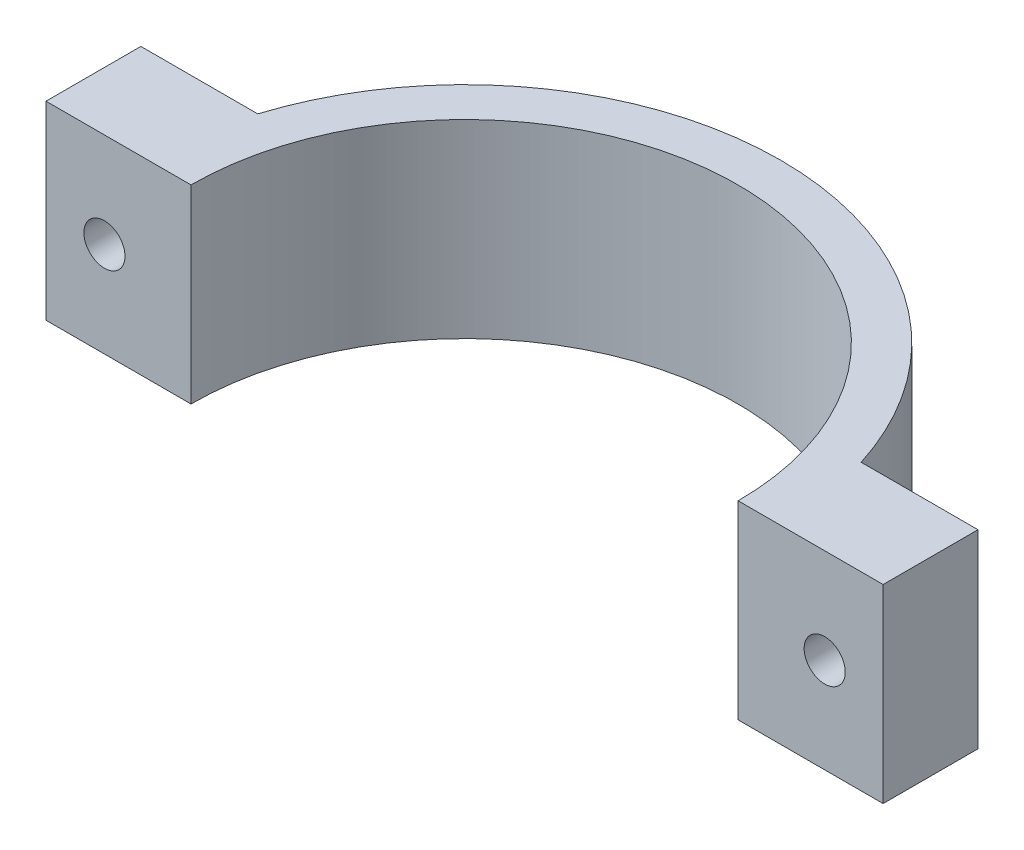
ISO-10303-21;
HEADER;
FILE_DESCRIPTION(('STEP AP214'),'2;1');
FILE_NAME('part.step','',(''),(''),'','','');
FILE_SCHEMA(('AUTOMOTIVE_DESIGN { 1 0 10303 214 1 1 1 1 }'));
ENDSEC;
DATA;
#1=APPLICATION_CONTEXT('core data for automotive mechanical design processes');
#2=APPLICATION_PROTOCOL_DEFINITION('international standard','automotive_design',2000,#1);
#3=PRODUCT_CONTEXT('',#1,'mechanical');
#4=PRODUCT('Part','Part','',(#3));
#5=PRODUCT_RELATED_PRODUCT_CATEGORY('part','',(#4));
#6=PRODUCT_DEFINITION_FORMATION('','',#4);
#7=PRODUCT_DEFINITION_CONTEXT('part definition',#1,'design');
#8=PRODUCT_DEFINITION('design','',#6,#7);
#9=PRODUCT_DEFINITION_SHAPE('','',#8);
#10=(LENGTH_UNIT() NAMED_UNIT(*) SI_UNIT(.MILLI.,.METRE.));
#11=(NAMED_UNIT(*) PLANE_ANGLE_UNIT() SI_UNIT($,.RADIAN.));
#12=(NAMED_UNIT(*) SI_UNIT($,.STERADIAN.) SOLID_ANGLE_UNIT());
#13=UNCERTAINTY_MEASURE_WITH_UNIT(LENGTH_MEASURE(1.E-05),#10,'distance_accuracy_value','');
#14=(GEOMETRIC_REPRESENTATION_CONTEXT(3) GLOBAL_UNCERTAINTY_ASSIGNED_CONTEXT((#13)) GLOBAL_UNIT_ASSIGNED_CONTEXT((#10,
#11,#12)) REPRESENTATION_CONTEXT('',''));
#15=CARTESIAN_POINT('',(0.,0.,0.));
#16=DIRECTION('',(0.,0.,1.));
#17=DIRECTION('',(1.,0.,0.));
#18=AXIS2_PLACEMENT_3D('',#15,#16,#17);
#19=CARTESIAN_POINT('',(0.,15.,0.));
#20=DIRECTION('',(0.,-1.,0.));
#21=DIRECTION('',(0.,0.,-1.));
#22=AXIS2_PLACEMENT_3D('',#19,#20,#21);
#23=CYLINDRICAL_SURFACE('',#22,43.25);
#24=CARTESIAN_POINT('',(0.,-15.,0.));
#25=DIRECTION('',(0.,-1.,0.));
#26=DIRECTION('',(0.,0.,-1.));
#27=AXIS2_PLACEMENT_3D('',#24,#25,#26);
#28=CIRCLE('',#27,43.25);
#29=CARTESIAN_POINT('',(-43.25,-15.,0.));
#30=VERTEX_POINT('',#29);
#31=CARTESIAN_POINT('',(43.25,-15.,0.));
#32=VERTEX_POINT('',#31);
#33=EDGE_CURVE('E135',#30,#32,#28,.T.);
#34=ORIENTED_EDGE('',*,*,#33,.T.);
#35=DIRECTION('',(0.,-1.,0.));
#36=VECTOR('',#35,1.);
#37=CARTESIAN_POINT('',(43.25,15.,0.));
#38=LINE('',#37,#36);
#39=CARTESIAN_POINT('',(43.25,15.,0.));
#40=VERTEX_POINT('',#39);
#41=EDGE_CURVE('E11',#40,#32,#38,.T.);
#42=ORIENTED_EDGE('',*,*,#41,.F.);
#43=CARTESIAN_POINT('',(0.,15.,0.));
#44=DIRECTION('',(0.,-1.,0.));
#45=DIRECTION('',(0.,0.,-1.));
#46=AXIS2_PLACEMENT_3D('',#43,#44,#45);
#47=CIRCLE('',#46,43.25);
#48=CARTESIAN_POINT('',(-43.25,15.,0.));
#49=VERTEX_POINT('',#48);
#50=EDGE_CURVE('E150',#49,#40,#47,.T.);
#51=ORIENTED_EDGE('',*,*,#50,.F.);
#52=DIRECTION('',(0.,-1.,0.));
#53=VECTOR('',#52,1.);
#54=CARTESIAN_POINT('',(-43.25,15.,0.));
#55=LINE('',#54,#53);
#56=EDGE_CURVE('E131',#49,#30,#55,.T.);
#57=ORIENTED_EDGE('',*,*,#56,.T.);
#58=EDGE_LOOP('',(#34,#42,#51,#57));
#59=FACE_BOUND('',#58,.T.);
#60=ADVANCED_FACE('F39',(#59),#23,.F.);
#61=CARTESIAN_POINT('',(43.25,15.,0.));
#62=DIRECTION('',(0.,0.,-1.));
#63=DIRECTION('',(-1.,0.,0.));
#64=AXIS2_PLACEMENT_3D('',#61,#62,#63);
#65=PLANE('',#64);
#66=CARTESIAN_POINT('',(56.9359800354236,0.,0.));
#67=DIRECTION('',(0.,0.,-1.));
#68=DIRECTION('',(1.,0.,0.));
#69=AXIS2_PLACEMENT_3D('',#66,#67,#68);
#70=CIRCLE('',#69,3.25);
#71=CARTESIAN_POINT('',(53.6859800354236,0.,0.));
#72=VERTEX_POINT('',#71);
#73=EDGE_CURVE('E183',#72,#72,#70,.T.);
#74=ORIENTED_EDGE('',*,*,#73,.T.);
#75=EDGE_LOOP('',(#74));
#76=FACE_BOUND('',#75,.T.);
#77=DIRECTION('',(1.,0.,0.));
#78=VECTOR('',#77,1.);
#79=CARTESIAN_POINT('',(43.25,-15.,0.));
#80=LINE('',#79,#78);
#81=CARTESIAN_POINT('',(66.175,-15.,0.));
#82=VERTEX_POINT('',#81);
#83=EDGE_CURVE('E138',#32,#82,#80,.T.);
#84=ORIENTED_EDGE('',*,*,#83,.T.);
#85=DIRECTION('',(0.,-1.,0.));
#86=VECTOR('',#85,1.);
#87=CARTESIAN_POINT('',(66.175,15.,0.));
#88=LINE('',#87,#86);
#89=CARTESIAN_POINT('',(66.175,15.,0.));
#90=VERTEX_POINT('',#89);
#91=EDGE_CURVE('E47',#90,#82,#88,.T.);
#92=ORIENTED_EDGE('',*,*,#91,.F.);
#93=DIRECTION('',(1.,0.,0.));
#94=VECTOR('',#93,1.);
#95=CARTESIAN_POINT('',(43.25,15.,0.));
#96=LINE('',#95,#94);
#97=EDGE_CURVE('E98',#40,#90,#96,.T.);
#98=ORIENTED_EDGE('',*,*,#97,.F.);
#99=ORIENTED_EDGE('',*,*,#41,.T.);
#100=EDGE_LOOP('',(#84,#92,#98,#99));
#101=FACE_BOUND('',#100,.T.);
#102=ADVANCED_FACE('F215',(#76,#101),#65,.F.);
#103=CARTESIAN_POINT('',(66.175,15.,0.));
#104=DIRECTION('',(-1.,0.,0.));
#105=DIRECTION('',(0.,0.,1.));
#106=AXIS2_PLACEMENT_3D('',#103,#104,#105);
#107=PLANE('',#106);
#108=DIRECTION('',(0.,0.,-1.));
#109=VECTOR('',#108,1.);
#110=CARTESIAN_POINT('',(66.175,-15.,0.));
#111=LINE('',#110,#109);
#112=CARTESIAN_POINT('',(66.175,-15.,-15.));
#113=VERTEX_POINT('',#112);
#114=EDGE_CURVE('E141',#82,#113,#111,.T.);
#115=ORIENTED_EDGE('',*,*,#114,.T.);
#116=DIRECTION('',(0.,-1.,0.));
#117=VECTOR('',#116,1.);
#118=CARTESIAN_POINT('',(66.175,15.,-15.));
#119=LINE('',#118,#117);
#120=CARTESIAN_POINT('',(66.175,15.,-15.));
#121=VERTEX_POINT('',#120);
#122=EDGE_CURVE('E157',#121,#113,#119,.T.);
#123=ORIENTED_EDGE('',*,*,#122,.F.);
#124=DIRECTION('',(0.,0.,-1.));
#125=VECTOR('',#124,1.);
#126=CARTESIAN_POINT('',(66.175,15.,0.));
#127=LINE('',#126,#125);
#128=EDGE_CURVE('E165',#90,#121,#127,.T.);
#129=ORIENTED_EDGE('',*,*,#128,.F.);
#130=ORIENTED_EDGE('',*,*,#91,.T.);
#131=EDGE_LOOP('',(#115,#123,#129,#130));
#132=FACE_BOUND('',#131,.T.);
#133=ADVANCED_FACE('F163',(#132),#107,.F.);
#134=CARTESIAN_POINT('',(47.6969600708473,15.,-15.));
#135=DIRECTION('',(0.,0.,1.));
#136=DIRECTION('',(1.,0.,0.));
#137=AXIS2_PLACEMENT_3D('',#134,#135,#136);
#138=PLANE('',#137);
#139=CARTESIAN_POINT('',(56.9359800354236,0.,-15.));
#140=DIRECTION('',(0.,0.,-1.));
#141=DIRECTION('',(1.,0.,0.));
#142=AXIS2_PLACEMENT_3D('',#139,#140,#141);
#143=CIRCLE('',#142,3.25);
#144=CARTESIAN_POINT('',(53.6859800354236,0.,-15.));
#145=VERTEX_POINT('',#144);
#146=EDGE_CURVE('E186',#145,#145,#143,.T.);
#147=ORIENTED_EDGE('',*,*,#146,.F.);
#148=EDGE_LOOP('',(#147));
#149=FACE_BOUND('',#148,.T.);
#150=DIRECTION('',(-1.,0.,0.));
#151=VECTOR('',#150,1.);
#152=CARTESIAN_POINT('',(47.6969600708473,-15.,-15.));
#153=LINE('',#152,#151);
#154=CARTESIAN_POINT('',(47.6969600708473,-15.,-15.));
#155=VERTEX_POINT('',#154);
#156=EDGE_CURVE('E143',#113,#155,#153,.T.);
#157=ORIENTED_EDGE('',*,*,#156,.T.);
#158=DIRECTION('',(0.,-1.,0.));
#159=VECTOR('',#158,1.);
#160=CARTESIAN_POINT('',(47.6969600708473,15.,-15.));
#161=LINE('',#160,#159);
#162=CARTESIAN_POINT('',(47.6969600708473,15.,-15.));
#163=VERTEX_POINT('',#162);
#164=EDGE_CURVE('E154',#163,#155,#161,.T.);
#165=ORIENTED_EDGE('',*,*,#164,.F.);
#166=DIRECTION('',(-1.,0.,0.));
#167=VECTOR('',#166,1.);
#168=CARTESIAN_POINT('',(47.6969600708473,15.,-15.));
#169=LINE('',#168,#167);
#170=EDGE_CURVE('E177',#121,#163,#169,.T.);
#171=ORIENTED_EDGE('',*,*,#170,.F.);
#172=ORIENTED_EDGE('',*,*,#122,.T.);
#173=EDGE_LOOP('',(#157,#165,#171,#172));
#174=FACE_BOUND('',#173,.T.);
#175=ADVANCED_FACE('F173',(#149,#174),#138,.F.);
#176=CARTESIAN_POINT('',(0.,15.,0.));
#177=DIRECTION('',(0.,-1.,0.));
#178=DIRECTION('',(0.,0.,-1.));
#179=AXIS2_PLACEMENT_3D('',#176,#177,#178);
#180=CYLINDRICAL_SURFACE('',#179,50.);
#181=CARTESIAN_POINT('',(0.,-15.,0.));
#182=DIRECTION('',(0.,1.,0.));
#183=DIRECTION('',(0.,0.,-1.));
#184=AXIS2_PLACEMENT_3D('',#181,#182,#183);
#185=CIRCLE('',#184,50.);
#186=CARTESIAN_POINT('',(-47.6969600708473,-15.,-15.));
#187=VERTEX_POINT('',#186);
#188=EDGE_CURVE('E145',#155,#187,#185,.T.);
#189=ORIENTED_EDGE('',*,*,#188,.T.);
#190=DIRECTION('',(0.,-1.,0.));
#191=VECTOR('',#190,1.);
#192=CARTESIAN_POINT('',(-47.6969600708473,15.,-15.));
#193=LINE('',#192,#191);
#194=CARTESIAN_POINT('',(-47.6969600708473,15.,-15.));
#195=VERTEX_POINT('',#194);
#196=EDGE_CURVE('E126',#195,#187,#193,.T.);
#197=ORIENTED_EDGE('',*,*,#196,.F.);
#198=CARTESIAN_POINT('',(0.,15.,0.));
#199=DIRECTION('',(0.,1.,0.));
#200=DIRECTION('',(0.,0.,-1.));
#201=AXIS2_PLACEMENT_3D('',#198,#199,#200);
#202=CIRCLE('',#201,50.);
#203=EDGE_CURVE('E117',#163,#195,#202,.T.);
#204=ORIENTED_EDGE('',*,*,#203,.F.);
#205=ORIENTED_EDGE('',*,*,#164,.T.);
#206=EDGE_LOOP('',(#189,#197,#204,#205));
#207=FACE_BOUND('',#206,.T.);
#208=ADVANCED_FACE('F176',(#207),#180,.T.);
#209=CARTESIAN_POINT('',(-66.175,15.,-15.));
#210=DIRECTION('',(0.,0.,1.));
#211=DIRECTION('',(1.,0.,0.));
#212=AXIS2_PLACEMENT_3D('',#209,#210,#211);
#213=PLANE('',#212);
#214=CARTESIAN_POINT('',(-56.9359800354236,0.,-15.));
#215=DIRECTION('',(0.,0.,-1.));
#216=DIRECTION('',(-1.,0.,0.));
#217=AXIS2_PLACEMENT_3D('',#214,#215,#216);
#218=CIRCLE('',#217,3.25);
#219=CARTESIAN_POINT('',(-60.1859800354236,0.,-15.));
#220=VERTEX_POINT('',#219);
#221=EDGE_CURVE('E189',#220,#220,#218,.T.);
#222=ORIENTED_EDGE('',*,*,#221,.F.);
#223=EDGE_LOOP('',(#222));
#224=FACE_BOUND('',#223,.T.);
#225=DIRECTION('',(-1.,0.,0.));
#226=VECTOR('',#225,1.);
#227=CARTESIAN_POINT('',(-66.175,-15.,-15.));
#228=LINE('',#227,#226);
#229=CARTESIAN_POINT('',(-66.175,-15.,-15.));
#230=VERTEX_POINT('',#229);
#231=EDGE_CURVE('E125',#187,#230,#228,.T.);
#232=ORIENTED_EDGE('',*,*,#231,.T.);
#233=DIRECTION('',(0.,-1.,0.));
#234=VECTOR('',#233,1.);
#235=CARTESIAN_POINT('',(-66.175,15.,-15.));
#236=LINE('',#235,#234);
#237=CARTESIAN_POINT('',(-66.175,15.,-15.));
#238=VERTEX_POINT('',#237);
#239=EDGE_CURVE('E122',#238,#230,#236,.T.);
#240=ORIENTED_EDGE('',*,*,#239,.F.);
#241=DIRECTION('',(-1.,0.,0.));
#242=VECTOR('',#241,1.);
#243=CARTESIAN_POINT('',(-66.175,15.,-15.));
#244=LINE('',#243,#242);
#245=EDGE_CURVE('E111',#195,#238,#244,.T.);
#246=ORIENTED_EDGE('',*,*,#245,.F.);
#247=ORIENTED_EDGE('',*,*,#196,.T.);
#248=EDGE_LOOP('',(#232,#240,#246,#247));
#249=FACE_BOUND('',#248,.T.);
#250=ADVANCED_FACE('F123',(#224,#249),#213,.F.);
#251=CARTESIAN_POINT('',(-66.175,15.,0.));
#252=DIRECTION('',(1.,0.,0.));
#253=DIRECTION('',(0.,0.,-1.));
#254=AXIS2_PLACEMENT_3D('',#251,#252,#253);
#255=PLANE('',#254);
#256=DIRECTION('',(0.,0.,1.));
#257=VECTOR('',#256,1.);
#258=CARTESIAN_POINT('',(-66.175,-15.,0.));
#259=LINE('',#258,#257);
#260=CARTESIAN_POINT('',(-66.175,-15.,0.));
#261=VERTEX_POINT('',#260);
#262=EDGE_CURVE('E84',#230,#261,#259,.T.);
#263=ORIENTED_EDGE('',*,*,#262,.T.);
#264=DIRECTION('',(0.,-1.,0.));
#265=VECTOR('',#264,1.);
#266=CARTESIAN_POINT('',(-66.175,15.,0.));
#267=LINE('',#266,#265);
#268=CARTESIAN_POINT('',(-66.175,15.,0.));
#269=VERTEX_POINT('',#268);
#270=EDGE_CURVE('E127',#269,#261,#267,.T.);
#271=ORIENTED_EDGE('',*,*,#270,.F.);
#272=DIRECTION('',(0.,0.,1.));
#273=VECTOR('',#272,1.);
#274=CARTESIAN_POINT('',(-66.175,15.,0.));
#275=LINE('',#274,#273);
#276=EDGE_CURVE('E115',#238,#269,#275,.T.);
#277=ORIENTED_EDGE('',*,*,#276,.F.);
#278=ORIENTED_EDGE('',*,*,#239,.T.);
#279=EDGE_LOOP('',(#263,#271,#277,#278));
#280=FACE_BOUND('',#279,.T.);
#281=ADVANCED_FACE('F129',(#280),#255,.F.);
#282=CARTESIAN_POINT('',(-66.175,15.,0.));
#283=DIRECTION('',(0.,0.,-1.));
#284=DIRECTION('',(-1.,0.,0.));
#285=AXIS2_PLACEMENT_3D('',#282,#283,#284);
#286=PLANE('',#285);
#287=CARTESIAN_POINT('',(-56.9359800354236,0.,0.));
#288=DIRECTION('',(0.,0.,-1.));
#289=DIRECTION('',(-1.,0.,0.));
#290=AXIS2_PLACEMENT_3D('',#287,#288,#289);
#291=CIRCLE('',#290,3.25);
#292=CARTESIAN_POINT('',(-60.1859800354236,0.,0.));
#293=VERTEX_POINT('',#292);
#294=EDGE_CURVE('E139',#293,#293,#291,.T.);
#295=ORIENTED_EDGE('',*,*,#294,.T.);
#296=EDGE_LOOP('',(#295));
#297=FACE_BOUND('',#296,.T.);
#298=DIRECTION('',(1.,0.,0.));
#299=VECTOR('',#298,1.);
#300=CARTESIAN_POINT('',(-66.175,-15.,0.));
#301=LINE('',#300,#299);
#302=EDGE_CURVE('E90',#261,#30,#301,.T.);
#303=ORIENTED_EDGE('',*,*,#302,.T.);
#304=ORIENTED_EDGE('',*,*,#56,.F.);
#305=DIRECTION('',(1.,0.,0.));
#306=VECTOR('',#305,1.);
#307=CARTESIAN_POINT('',(-66.175,15.,0.));
#308=LINE('',#307,#306);
#309=EDGE_CURVE('E55',#269,#49,#308,.T.);
#310=ORIENTED_EDGE('',*,*,#309,.F.);
#311=ORIENTED_EDGE('',*,*,#270,.T.);
#312=EDGE_LOOP('',(#303,#304,#310,#311));
#313=FACE_BOUND('',#312,.T.);
#314=ADVANCED_FACE('F195',(#297,#313),#286,.F.);
#315=CARTESIAN_POINT('',(0.,15.,0.));
#316=DIRECTION('',(0.,-1.,0.));
#317=DIRECTION('',(0.,0.,-1.));
#318=AXIS2_PLACEMENT_3D('',#315,#316,#317);
#319=PLANE('',#318);
#320=ORIENTED_EDGE('',*,*,#50,.T.);
#321=ORIENTED_EDGE('',*,*,#97,.T.);
#322=ORIENTED_EDGE('',*,*,#128,.T.);
#323=ORIENTED_EDGE('',*,*,#170,.T.);
#324=ORIENTED_EDGE('',*,*,#203,.T.);
#325=ORIENTED_EDGE('',*,*,#245,.T.);
#326=ORIENTED_EDGE('',*,*,#276,.T.);
#327=ORIENTED_EDGE('',*,*,#309,.T.);
#328=EDGE_LOOP('',(#320,#321,#322,#323,#324,#325,#326,#327));
#329=FACE_BOUND('',#328,.T.);
#330=ADVANCED_FACE('F113',(#329),#319,.F.);
#331=CARTESIAN_POINT('',(0.,-15.,0.));
#332=DIRECTION('',(0.,-1.,0.));
#333=DIRECTION('',(0.,0.,-1.));
#334=AXIS2_PLACEMENT_3D('',#331,#332,#333);
#335=PLANE('',#334);
#336=ORIENTED_EDGE('',*,*,#33,.F.);
#337=ORIENTED_EDGE('',*,*,#302,.F.);
#338=ORIENTED_EDGE('',*,*,#262,.F.);
#339=ORIENTED_EDGE('',*,*,#231,.F.);
#340=ORIENTED_EDGE('',*,*,#188,.F.);
#341=ORIENTED_EDGE('',*,*,#156,.F.);
#342=ORIENTED_EDGE('',*,*,#114,.F.);
#343=ORIENTED_EDGE('',*,*,#83,.F.);
#344=EDGE_LOOP('',(#336,#337,#338,#339,#340,#341,#342,#343));
#345=FACE_BOUND('',#344,.T.);
#346=ADVANCED_FACE('F169',(#345),#335,.T.);
#347=CARTESIAN_POINT('',(-56.9359800354236,0.,0.));
#348=DIRECTION('',(0.,0.,-1.));
#349=DIRECTION('',(-1.,0.,0.));
#350=AXIS2_PLACEMENT_3D('',#347,#348,#349);
#351=CYLINDRICAL_SURFACE('',#350,3.25);
#352=CARTESIAN_POINT('',(-60.1859800354236,0.,0.));
#353=CARTESIAN_POINT('',(-60.1859800354236,0.,-0.15625));
#354=CARTESIAN_POINT('',(-60.1859800354236,0.,-0.3125));
#355=CARTESIAN_POINT('',(-60.1859800354236,0.,-0.625));
#356=CARTESIAN_POINT('',(-60.1859800354236,0.,-0.78125));
#357=CARTESIAN_POINT('',(-60.1859800354236,0.,-1.09375));
#358=CARTESIAN_POINT('',(-60.1859800354236,0.,-1.25));
#359=CARTESIAN_POINT('',(-60.1859800354236,0.,-1.5625));
#360=CARTESIAN_POINT('',(-60.1859800354236,0.,-1.71875));
#361=CARTESIAN_POINT('',(-60.1859800354236,0.,-2.03125));
#362=CARTESIAN_POINT('',(-60.1859800354236,0.,-2.1875));
#363=CARTESIAN_POINT('',(-60.1859800354236,0.,-2.5));
#364=CARTESIAN_POINT('',(-60.1859800354236,0.,-2.65625));
#365=CARTESIAN_POINT('',(-60.1859800354236,0.,-2.96875));
#366=CARTESIAN_POINT('',(-60.1859800354236,0.,-3.125));
#367=CARTESIAN_POINT('',(-60.1859800354236,0.,-3.4375));
#368=CARTESIAN_POINT('',(-60.1859800354236,0.,-3.59375));
#369=CARTESIAN_POINT('',(-60.1859800354236,0.,-3.90625));
#370=CARTESIAN_POINT('',(-60.1859800354236,0.,-4.0625));
#371=CARTESIAN_POINT('',(-60.1859800354236,0.,-4.375));
#372=CARTESIAN_POINT('',(-60.1859800354236,0.,-4.53125));
#373=CARTESIAN_POINT('',(-60.1859800354236,0.,-4.84375));
#374=CARTESIAN_POINT('',(-60.1859800354236,0.,-5.));
#375=CARTESIAN_POINT('',(-60.1859800354236,0.,-5.3125));
#376=CARTESIAN_POINT('',(-60.1859800354236,0.,-5.46875));
#377=CARTESIAN_POINT('',(-60.1859800354236,0.,-5.78125));
#378=CARTESIAN_POINT('',(-60.1859800354236,0.,-5.9375));
#379=CARTESIAN_POINT('',(-60.1859800354236,0.,-6.25));
#380=CARTESIAN_POINT('',(-60.1859800354236,0.,-6.40625));
#381=CARTESIAN_POINT('',(-60.1859800354236,0.,-6.71875));
#382=CARTESIAN_POINT('',(-60.1859800354236,0.,-6.875));
#383=CARTESIAN_POINT('',(-60.1859800354236,0.,-7.1875));
#384=CARTESIAN_POINT('',(-60.1859800354236,0.,-7.34375));
#385=CARTESIAN_POINT('',(-60.1859800354236,0.,-7.65625));
#386=CARTESIAN_POINT('',(-60.1859800354236,0.,-7.8125));
#387=CARTESIAN_POINT('',(-60.1859800354236,0.,-8.125));
#388=CARTESIAN_POINT('',(-60.1859800354236,0.,-8.28125));
#389=CARTESIAN_POINT('',(-60.1859800354236,0.,-8.59375));
#390=CARTESIAN_POINT('',(-60.1859800354236,0.,-8.75));
#391=CARTESIAN_POINT('',(-60.1859800354236,0.,-9.0625));
#392=CARTESIAN_POINT('',(-60.1859800354236,0.,-9.21875));
#393=CARTESIAN_POINT('',(-60.1859800354236,0.,-9.53125));
#394=CARTESIAN_POINT('',(-60.1859800354236,0.,-9.6875));
#395=CARTESIAN_POINT('',(-60.1859800354236,0.,-10.));
#396=CARTESIAN_POINT('',(-60.1859800354236,0.,-10.15625));
#397=CARTESIAN_POINT('',(-60.1859800354236,0.,-10.46875));
#398=CARTESIAN_POINT('',(-60.1859800354236,0.,-10.625));
#399=CARTESIAN_POINT('',(-60.1859800354236,0.,-10.9375));
#400=CARTESIAN_POINT('',(-60.1859800354236,0.,-11.09375));
#401=CARTESIAN_POINT('',(-60.1859800354236,0.,-11.40625));
#402=CARTESIAN_POINT('',(-60.1859800354236,0.,-11.5625));
#403=CARTESIAN_POINT('',(-60.1859800354236,0.,-11.875));
#404=CARTESIAN_POINT('',(-60.1859800354236,0.,-12.03125));
#405=CARTESIAN_POINT('',(-60.1859800354236,0.,-12.34375));
#406=CARTESIAN_POINT('',(-60.1859800354236,0.,-12.5));
#407=CARTESIAN_POINT('',(-60.1859800354236,0.,-12.8125));
#408=CARTESIAN_POINT('',(-60.1859800354236,0.,-12.96875));
#409=CARTESIAN_POINT('',(-60.1859800354236,0.,-13.28125));
#410=CARTESIAN_POINT('',(-60.1859800354236,0.,-13.4375));
#411=CARTESIAN_POINT('',(-60.1859800354236,0.,-13.75));
#412=CARTESIAN_POINT('',(-60.1859800354236,0.,-13.90625));
#413=CARTESIAN_POINT('',(-60.1859800354236,0.,-14.21875));
#414=CARTESIAN_POINT('',(-60.1859800354236,0.,-14.375));
#415=CARTESIAN_POINT('',(-60.1859800354236,0.,-14.6875));
#416=CARTESIAN_POINT('',(-60.1859800354236,0.,-14.84375));
#417=CARTESIAN_POINT('',(-60.1859800354236,0.,-15.));
#418=B_SPLINE_CURVE_WITH_KNOTS('',3,(#352,#353,#354,#355,#356,#357,#358,#359,#360,#361,#362,
#363,#364,#365,#366,#367,#368,#369,#370,#371,#372,#373,#374,#375,#376,#377,#378,#379,#380,#381,
#382,#383,#384,#385,#386,#387,#388,#389,#390,#391,#392,#393,#394,#395,#396,#397,#398,#399,#400,
#401,#402,#403,#404,#405,#406,#407,#408,#409,#410,#411,#412,#413,#414,#415,#416,#417),
.UNSPECIFIED.,.F.,.F.,(4,2,2,2,2,2,2,2,2,2,2,2,2,2,2,2,2,2,2,2,2,2,2,2,2,2,2,2,2,2,2,2,4),(0.,
0.46875,0.9375,1.40625,1.875,2.34375,2.8125,3.28125,3.75,4.21875,4.6875,5.15625,5.625,6.09375,
6.5625,7.03125,7.5,7.96875,8.4375,8.90625,9.375,9.84375,10.3125,10.78125,11.25,11.71875,12.1875,
12.65625,13.125,13.59375,14.0625,14.53125,15.),.UNSPECIFIED.);
#419=EDGE_CURVE('BSEAM197',#293,#220,#418,.T.);
#420=ORIENTED_EDGE('',*,*,#294,.F.);
#421=ORIENTED_EDGE('',*,*,#221,.T.);
#422=ORIENTED_EDGE('',*,*,#419,.T.);
#423=ORIENTED_EDGE('',*,*,#419,.F.);
#424=EDGE_LOOP('',(#420,#422,#421,#423));
#425=FACE_BOUND('',#424,.T.);
#426=ADVANCED_FACE('F197',(#425),#351,.F.);
#427=CARTESIAN_POINT('',(56.9359800354236,0.,0.));
#428=DIRECTION('',(0.,0.,-1.));
#429=DIRECTION('',(-1.,0.,0.));
#430=AXIS2_PLACEMENT_3D('',#427,#428,#429);
#431=CYLINDRICAL_SURFACE('',#430,3.25);
#432=CARTESIAN_POINT('',(53.6859800354236,0.,0.));
#433=CARTESIAN_POINT('',(53.6859800354236,0.,-0.15624999999999));
#434=CARTESIAN_POINT('',(53.6859800354236,0.,-0.31249999999999));
#435=CARTESIAN_POINT('',(53.6859800354236,0.,-0.62499999999999));
#436=CARTESIAN_POINT('',(53.6859800354236,0.,-0.78124999999999));
#437=CARTESIAN_POINT('',(53.6859800354236,0.,-1.09374999999999));
#438=CARTESIAN_POINT('',(53.6859800354236,0.,-1.24999999999999));
#439=CARTESIAN_POINT('',(53.6859800354236,0.,-1.56249999999999));
#440=CARTESIAN_POINT('',(53.6859800354236,0.,-1.71874999999999));
#441=CARTESIAN_POINT('',(53.6859800354236,0.,-2.03124999999999));
#442=CARTESIAN_POINT('',(53.6859800354236,0.,-2.18749999999999));
#443=CARTESIAN_POINT('',(53.6859800354236,0.,-2.49999999999999));
#444=CARTESIAN_POINT('',(53.6859800354236,0.,-2.65624999999999));
#445=CARTESIAN_POINT('',(53.6859800354236,0.,-2.96874999999999));
#446=CARTESIAN_POINT('',(53.6859800354236,0.,-3.12499999999999));
#447=CARTESIAN_POINT('',(53.6859800354236,0.,-3.43749999999999));
#448=CARTESIAN_POINT('',(53.6859800354236,0.,-3.59374999999999));
#449=CARTESIAN_POINT('',(53.6859800354236,0.,-3.90624999999999));
#450=CARTESIAN_POINT('',(53.6859800354236,0.,-4.06249999999999));
#451=CARTESIAN_POINT('',(53.6859800354236,0.,-4.37499999999999));
#452=CARTESIAN_POINT('',(53.6859800354236,0.,-4.53124999999999));
#453=CARTESIAN_POINT('',(53.6859800354236,0.,-4.84374999999999));
#454=CARTESIAN_POINT('',(53.6859800354236,0.,-4.99999999999999));
#455=CARTESIAN_POINT('',(53.6859800354236,0.,-5.31249999999999));
#456=CARTESIAN_POINT('',(53.6859800354236,0.,-5.46874999999999));
#457=CARTESIAN_POINT('',(53.6859800354236,0.,-5.78124999999999));
#458=CARTESIAN_POINT('',(53.6859800354236,0.,-5.93749999999999));
#459=CARTESIAN_POINT('',(53.6859800354236,0.,-6.24999999999999));
#460=CARTESIAN_POINT('',(53.6859800354236,0.,-6.40624999999999));
#461=CARTESIAN_POINT('',(53.6859800354236,0.,-6.71874999999999));
#462=CARTESIAN_POINT('',(53.6859800354236,0.,-6.87499999999999));
#463=CARTESIAN_POINT('',(53.6859800354236,0.,-7.18749999999999));
#464=CARTESIAN_POINT('',(53.6859800354236,0.,-7.34374999999999));
#465=CARTESIAN_POINT('',(53.6859800354236,0.,-7.65624999999999));
#466=CARTESIAN_POINT('',(53.6859800354236,0.,-7.81249999999999));
#467=CARTESIAN_POINT('',(53.6859800354236,0.,-8.12499999999999));
#468=CARTESIAN_POINT('',(53.6859800354236,0.,-8.28124999999999));
#469=CARTESIAN_POINT('',(53.6859800354236,0.,-8.59374999999999));
#470=CARTESIAN_POINT('',(53.6859800354236,0.,-8.74999999999999));
#471=CARTESIAN_POINT('',(53.6859800354236,0.,-9.06249999999999));
#472=CARTESIAN_POINT('',(53.6859800354236,0.,-9.21874999999999));
#473=CARTESIAN_POINT('',(53.6859800354236,0.,-9.53124999999999));
#474=CARTESIAN_POINT('',(53.6859800354236,0.,-9.68749999999999));
#475=CARTESIAN_POINT('',(53.6859800354236,0.,-9.99999999999999));
#476=CARTESIAN_POINT('',(53.6859800354236,0.,-10.15625));
#477=CARTESIAN_POINT('',(53.6859800354236,0.,-10.46875));
#478=CARTESIAN_POINT('',(53.6859800354236,0.,-10.625));
#479=CARTESIAN_POINT('',(53.6859800354236,0.,-10.9375));
#480=CARTESIAN_POINT('',(53.6859800354236,0.,-11.09375));
#481=CARTESIAN_POINT('',(53.6859800354236,0.,-11.40625));
#482=CARTESIAN_POINT('',(53.6859800354236,0.,-11.5625));
#483=CARTESIAN_POINT('',(53.6859800354236,0.,-11.875));
#484=CARTESIAN_POINT('',(53.6859800354236,0.,-12.03125));
#485=CARTESIAN_POINT('',(53.6859800354236,0.,-12.34375));
#486=CARTESIAN_POINT('',(53.6859800354236,0.,-12.5));
#487=CARTESIAN_POINT('',(53.6859800354236,0.,-12.8125));
#488=CARTESIAN_POINT('',(53.6859800354236,0.,-12.96875));
#489=CARTESIAN_POINT('',(53.6859800354236,0.,-13.28125));
#490=CARTESIAN_POINT('',(53.6859800354236,0.,-13.4375));
#491=CARTESIAN_POINT('',(53.6859800354236,0.,-13.75));
#492=CARTESIAN_POINT('',(53.6859800354236,0.,-13.90625));
#493=CARTESIAN_POINT('',(53.6859800354236,0.,-14.21875));
#494=CARTESIAN_POINT('',(53.6859800354236,0.,-14.375));
#495=CARTESIAN_POINT('',(53.6859800354236,0.,-14.6875));
#496=CARTESIAN_POINT('',(53.6859800354236,0.,-14.84375));
#497=CARTESIAN_POINT('',(53.6859800354236,0.,-15.));
#498=B_SPLINE_CURVE_WITH_KNOTS('',3,(#432,#433,#434,#435,#436,#437,#438,#439,#440,#441,#442,
#443,#444,#445,#446,#447,#448,#449,#450,#451,#452,#453,#454,#455,#456,#457,#458,#459,#460,#461,
#462,#463,#464,#465,#466,#467,#468,#469,#470,#471,#472,#473,#474,#475,#476,#477,#478,#479,#480,
#481,#482,#483,#484,#485,#486,#487,#488,#489,#490,#491,#492,#493,#494,#495,#496,#497),
.UNSPECIFIED.,.F.,.F.,(4,2,2,2,2,2,2,2,2,2,2,2,2,2,2,2,2,2,2,2,2,2,2,2,2,2,2,2,2,2,2,2,4),(0.,
0.46875,0.9375,1.40625,1.875,2.34375,2.8125,3.28125,3.75,4.21875,4.6875,5.15625,5.625,6.09375,
6.5625,7.03125,7.5,7.96875,8.4375,8.90625,9.375,9.84375,10.3125,10.78125,11.25,11.71875,12.1875,
12.65625,13.125,13.59375,14.0625,14.53125,15.),.UNSPECIFIED.);
#499=EDGE_CURVE('BSEAM200',#72,#145,#498,.T.);
#500=ORIENTED_EDGE('',*,*,#73,.F.);
#501=ORIENTED_EDGE('',*,*,#146,.T.);
#502=ORIENTED_EDGE('',*,*,#499,.T.);
#503=ORIENTED_EDGE('',*,*,#499,.F.);
#504=EDGE_LOOP('',(#500,#502,#501,#503));
#505=FACE_BOUND('',#504,.T.);
#506=ADVANCED_FACE('F200',(#505),#431,.F.);
#507=CLOSED_SHELL('',(#60,#102,#133,#175,#208,#250,#281,#314,#330,#346,#426,#506));
#508=MANIFOLD_SOLID_BREP('B2',#507);
#509=ADVANCED_BREP_SHAPE_REPRESENTATION('',(#18,#508),#14);
#510=SHAPE_DEFINITION_REPRESENTATION(#9,#509);
ENDSEC;
END-ISO-10303-21;
